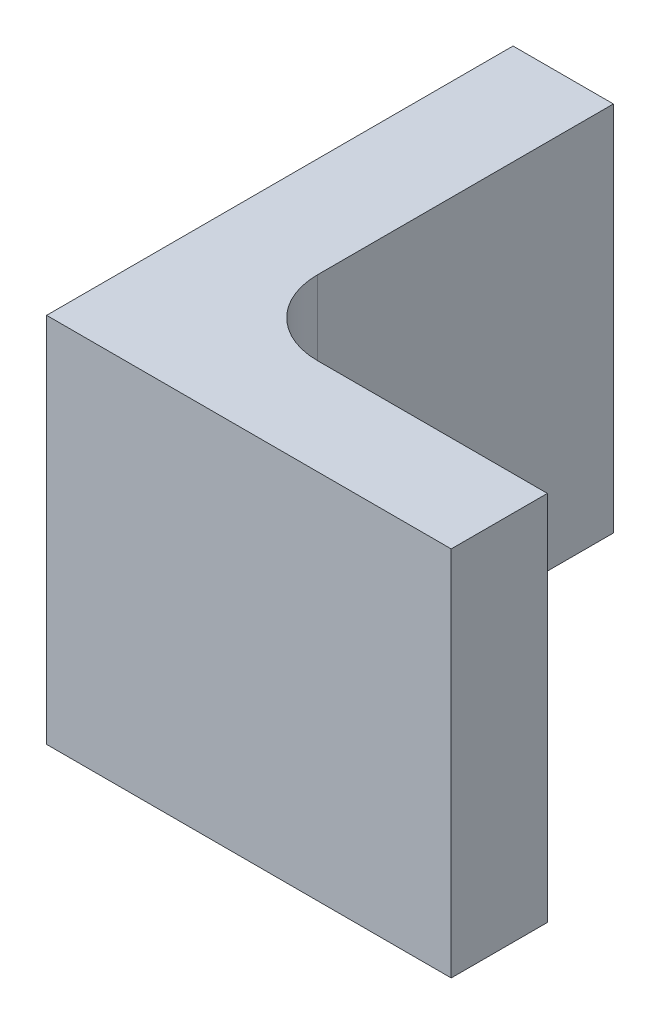
ISO-10303-21;
HEADER;
FILE_DESCRIPTION(('STEP AP214'),'2;1');
FILE_NAME('part.step','',(''),(''),'','','');
FILE_SCHEMA(('AUTOMOTIVE_DESIGN { 1 0 10303 214 1 1 1 1 }'));
ENDSEC;
DATA;
#1=APPLICATION_CONTEXT('core data for automotive mechanical design processes');
#2=APPLICATION_PROTOCOL_DEFINITION('international standard','automotive_design',2000,#1);
#3=PRODUCT_CONTEXT('',#1,'mechanical');
#4=PRODUCT('Part','Part','',(#3));
#5=PRODUCT_RELATED_PRODUCT_CATEGORY('part','',(#4));
#6=PRODUCT_DEFINITION_FORMATION('','',#4);
#7=PRODUCT_DEFINITION_CONTEXT('part definition',#1,'design');
#8=PRODUCT_DEFINITION('design','',#6,#7);
#9=PRODUCT_DEFINITION_SHAPE('','',#8);
#10=(LENGTH_UNIT() NAMED_UNIT(*) SI_UNIT(.MILLI.,.METRE.));
#11=(NAMED_UNIT(*) PLANE_ANGLE_UNIT() SI_UNIT($,.RADIAN.));
#12=(NAMED_UNIT(*) SI_UNIT($,.STERADIAN.) SOLID_ANGLE_UNIT());
#13=UNCERTAINTY_MEASURE_WITH_UNIT(LENGTH_MEASURE(1.E-05),#10,'distance_accuracy_value','');
#14=(GEOMETRIC_REPRESENTATION_CONTEXT(3) GLOBAL_UNCERTAINTY_ASSIGNED_CONTEXT((#13)) GLOBAL_UNIT_ASSIGNED_CONTEXT((#10,
#11,#12)) REPRESENTATION_CONTEXT('',''));
#15=CARTESIAN_POINT('',(0.,0.,0.));
#16=DIRECTION('',(0.,0.,1.));
#17=DIRECTION('',(1.,0.,0.));
#18=AXIS2_PLACEMENT_3D('',#15,#16,#17);
#19=CARTESIAN_POINT('',(0.,50.,-62.7616279069768));
#20=DIRECTION('',(1.,0.,0.));
#21=DIRECTION('',(0.,0.,-1.));
#22=AXIS2_PLACEMENT_3D('',#19,#20,#21);
#23=PLANE('',#22);
#24=DIRECTION('',(0.,0.,1.));
#25=VECTOR('',#24,1.);
#26=CARTESIAN_POINT('',(0.,0.,-62.7616279069768));
#27=LINE('',#26,#25);
#28=CARTESIAN_POINT('',(0.,0.,-62.7616279069768));
#29=VERTEX_POINT('',#28);
#30=CARTESIAN_POINT('',(0.,0.,0.));
#31=VERTEX_POINT('',#30);
#32=EDGE_CURVE('E123',#29,#31,#27,.T.);
#33=ORIENTED_EDGE('',*,*,#32,.T.);
#34=DIRECTION('',(0.,-1.,0.));
#35=VECTOR('',#34,1.);
#36=CARTESIAN_POINT('',(0.,50.,0.));
#37=LINE('',#36,#35);
#38=CARTESIAN_POINT('',(0.,50.,0.));
#39=VERTEX_POINT('',#38);
#40=EDGE_CURVE('E105',#39,#31,#37,.T.);
#41=ORIENTED_EDGE('',*,*,#40,.F.);
#42=DIRECTION('',(0.,0.,1.));
#43=VECTOR('',#42,1.);
#44=CARTESIAN_POINT('',(0.,50.,-62.7616279069768));
#45=LINE('',#44,#43);
#46=CARTESIAN_POINT('',(0.,50.,-62.7616279069768));
#47=VERTEX_POINT('',#46);
#48=EDGE_CURVE('E109',#47,#39,#45,.T.);
#49=ORIENTED_EDGE('',*,*,#48,.F.);
#50=DIRECTION('',(0.,-1.,0.));
#51=VECTOR('',#50,1.);
#52=CARTESIAN_POINT('',(0.,50.,-62.7616279069768));
#53=LINE('',#52,#51);
#54=EDGE_CURVE('E134',#47,#29,#53,.T.);
#55=ORIENTED_EDGE('',*,*,#54,.T.);
#56=EDGE_LOOP('',(#33,#41,#49,#55));
#57=FACE_BOUND('',#56,.T.);
#58=ADVANCED_FACE('F39',(#57),#23,.F.);
#59=CARTESIAN_POINT('',(0.,50.,0.));
#60=DIRECTION('',(0.,0.,-1.));
#61=DIRECTION('',(-1.,0.,0.));
#62=AXIS2_PLACEMENT_3D('',#59,#60,#61);
#63=PLANE('',#62);
#64=DIRECTION('',(1.,0.,0.));
#65=VECTOR('',#64,1.);
#66=CARTESIAN_POINT('',(0.,0.,0.));
#67=LINE('',#66,#65);
#68=CARTESIAN_POINT('',(54.4408530423065,0.,0.));
#69=VERTEX_POINT('',#68);
#70=EDGE_CURVE('E143',#31,#69,#67,.T.);
#71=ORIENTED_EDGE('',*,*,#70,.T.);
#72=DIRECTION('',(0.,-1.,0.));
#73=VECTOR('',#72,1.);
#74=CARTESIAN_POINT('',(54.4408530423065,50.,0.));
#75=LINE('',#74,#73);
#76=CARTESIAN_POINT('',(54.4408530423065,50.,0.));
#77=VERTEX_POINT('',#76);
#78=EDGE_CURVE('E103',#77,#69,#75,.T.);
#79=ORIENTED_EDGE('',*,*,#78,.F.);
#80=DIRECTION('',(1.,0.,0.));
#81=VECTOR('',#80,1.);
#82=CARTESIAN_POINT('',(0.,50.,0.));
#83=LINE('',#82,#81);
#84=EDGE_CURVE('E97',#39,#77,#83,.T.);
#85=ORIENTED_EDGE('',*,*,#84,.F.);
#86=ORIENTED_EDGE('',*,*,#40,.T.);
#87=EDGE_LOOP('',(#71,#79,#85,#86));
#88=FACE_BOUND('',#87,.T.);
#89=ADVANCED_FACE('F99',(#88),#63,.F.);
#90=CARTESIAN_POINT('',(54.4408530423065,50.,0.));
#91=DIRECTION('',(-1.,0.,0.));
#92=DIRECTION('',(0.,0.,1.));
#93=AXIS2_PLACEMENT_3D('',#90,#91,#92);
#94=PLANE('',#93);
#95=DIRECTION('',(0.,0.,-1.));
#96=VECTOR('',#95,1.);
#97=CARTESIAN_POINT('',(54.4408530423065,0.,0.));
#98=LINE('',#97,#96);
#99=CARTESIAN_POINT('',(54.4408530423065,0.,-12.9385509838998));
#100=VERTEX_POINT('',#99);
#101=EDGE_CURVE('E145',#69,#100,#98,.T.);
#102=ORIENTED_EDGE('',*,*,#101,.T.);
#103=DIRECTION('',(0.,-1.,0.));
#104=VECTOR('',#103,1.);
#105=CARTESIAN_POINT('',(54.4408530423065,50.,-12.9385509838998));
#106=LINE('',#105,#104);
#107=CARTESIAN_POINT('',(54.4408530423065,50.,-12.9385509838998));
#108=VERTEX_POINT('',#107);
#109=EDGE_CURVE('E128',#108,#100,#106,.T.);
#110=ORIENTED_EDGE('',*,*,#109,.F.);
#111=DIRECTION('',(0.,0.,-1.));
#112=VECTOR('',#111,1.);
#113=CARTESIAN_POINT('',(54.4408530423065,50.,0.));
#114=LINE('',#113,#112);
#115=EDGE_CURVE('E108',#77,#108,#114,.T.);
#116=ORIENTED_EDGE('',*,*,#115,.F.);
#117=ORIENTED_EDGE('',*,*,#78,.T.);
#118=EDGE_LOOP('',(#102,#110,#116,#117));
#119=FACE_BOUND('',#118,.T.);
#120=ADVANCED_FACE('F151',(#119),#94,.F.);
#121=CARTESIAN_POINT('',(54.4408530423065,50.,-12.9385509838998));
#122=DIRECTION('',(0.,0.,1.));
#123=DIRECTION('',(1.,0.,0.));
#124=AXIS2_PLACEMENT_3D('',#121,#122,#123);
#125=PLANE('',#124);
#126=DIRECTION('',(-1.,0.,0.));
#127=VECTOR('',#126,1.);
#128=CARTESIAN_POINT('',(54.4408530423065,0.,-12.9385509838998));
#129=LINE('',#128,#127);
#130=CARTESIAN_POINT('',(23.5009603768325,0.,-12.9385509838998));
#131=VERTEX_POINT('',#130);
#132=EDGE_CURVE('E139',#100,#131,#129,.T.);
#133=ORIENTED_EDGE('',*,*,#132,.T.);
#134=DIRECTION('',(0.,-1.,0.));
#135=VECTOR('',#134,1.);
#136=CARTESIAN_POINT('',(23.5009603768325,50.,-12.9385509838998));
#137=LINE('',#136,#135);
#138=CARTESIAN_POINT('',(23.5009603768325,50.,-12.9385509838998));
#139=VERTEX_POINT('',#138);
#140=EDGE_CURVE('E53',#131,#139,#137,.F.);
#141=ORIENTED_EDGE('',*,*,#140,.T.);
#142=DIRECTION('',(-1.,0.,0.));
#143=VECTOR('',#142,1.);
#144=CARTESIAN_POINT('',(54.4408530423065,50.,-12.9385509838998));
#145=LINE('',#144,#143);
#146=EDGE_CURVE('E148',#108,#139,#145,.T.);
#147=ORIENTED_EDGE('',*,*,#146,.F.);
#148=ORIENTED_EDGE('',*,*,#109,.T.);
#149=EDGE_LOOP('',(#133,#141,#147,#148));
#150=FACE_BOUND('',#149,.T.);
#151=ADVANCED_FACE('F160',(#150),#125,.F.);
#152=CARTESIAN_POINT('',(13.5009603768325,50.,-12.9385509838998));
#153=DIRECTION('',(-1.,0.,0.));
#154=DIRECTION('',(0.,0.,1.));
#155=AXIS2_PLACEMENT_3D('',#152,#153,#154);
#156=PLANE('',#155);
#157=DIRECTION('',(0.,0.,-1.));
#158=VECTOR('',#157,1.);
#159=CARTESIAN_POINT('',(13.5009603768325,50.,-12.9385509838998));
#160=LINE('',#159,#158);
#161=CARTESIAN_POINT('',(13.5009603768325,50.,-22.9385509838998));
#162=VERTEX_POINT('',#161);
#163=CARTESIAN_POINT('',(13.5009603768325,50.,-62.7616279069768));
#164=VERTEX_POINT('',#163);
#165=EDGE_CURVE('E149',#162,#164,#160,.T.);
#166=ORIENTED_EDGE('',*,*,#165,.F.);
#167=DIRECTION('',(0.,-1.,0.));
#168=VECTOR('',#167,1.);
#169=CARTESIAN_POINT('',(13.5009603768325,0.,-22.9385509838998));
#170=LINE('',#169,#168);
#171=CARTESIAN_POINT('',(13.5009603768325,0.,-22.9385509838998));
#172=VERTEX_POINT('',#171);
#173=EDGE_CURVE('E122',#162,#172,#170,.T.);
#174=ORIENTED_EDGE('',*,*,#173,.T.);
#175=DIRECTION('',(0.,0.,-1.));
#176=VECTOR('',#175,1.);
#177=CARTESIAN_POINT('',(13.5009603768325,0.,-12.9385509838998));
#178=LINE('',#177,#176);
#179=CARTESIAN_POINT('',(13.5009603768325,0.,-62.7616279069768));
#180=VERTEX_POINT('',#179);
#181=EDGE_CURVE('E138',#172,#180,#178,.T.);
#182=ORIENTED_EDGE('',*,*,#181,.T.);
#183=DIRECTION('',(0.,-1.,0.));
#184=VECTOR('',#183,1.);
#185=CARTESIAN_POINT('',(13.5009603768325,50.,-62.7616279069768));
#186=LINE('',#185,#184);
#187=EDGE_CURVE('E135',#164,#180,#186,.T.);
#188=ORIENTED_EDGE('',*,*,#187,.F.);
#189=EDGE_LOOP('',(#166,#174,#182,#188));
#190=FACE_BOUND('',#189,.T.);
#191=ADVANCED_FACE('F159',(#190),#156,.F.);
#192=CARTESIAN_POINT('',(13.5009603768325,50.,-62.7616279069768));
#193=DIRECTION('',(0.,0.,1.));
#194=DIRECTION('',(1.,0.,0.));
#195=AXIS2_PLACEMENT_3D('',#192,#193,#194);
#196=PLANE('',#195);
#197=DIRECTION('',(-1.,0.,0.));
#198=VECTOR('',#197,1.);
#199=CARTESIAN_POINT('',(13.5009603768325,0.,-62.7616279069768));
#200=LINE('',#199,#198);
#201=EDGE_CURVE('E118',#180,#29,#200,.T.);
#202=ORIENTED_EDGE('',*,*,#201,.T.);
#203=ORIENTED_EDGE('',*,*,#54,.F.);
#204=DIRECTION('',(-1.,0.,0.));
#205=VECTOR('',#204,1.);
#206=CARTESIAN_POINT('',(13.5009603768325,50.,-62.7616279069768));
#207=LINE('',#206,#205);
#208=EDGE_CURVE('E114',#164,#47,#207,.T.);
#209=ORIENTED_EDGE('',*,*,#208,.F.);
#210=ORIENTED_EDGE('',*,*,#187,.T.);
#211=EDGE_LOOP('',(#202,#203,#209,#210));
#212=FACE_BOUND('',#211,.T.);
#213=ADVANCED_FACE('F161',(#212),#196,.F.);
#214=CARTESIAN_POINT('',(0.,50.,0.));
#215=DIRECTION('',(0.,1.,0.));
#216=DIRECTION('',(0.,0.,1.));
#217=AXIS2_PLACEMENT_3D('',#214,#215,#216);
#218=PLANE('',#217);
#219=ORIENTED_EDGE('',*,*,#48,.T.);
#220=ORIENTED_EDGE('',*,*,#84,.T.);
#221=ORIENTED_EDGE('',*,*,#115,.T.);
#222=ORIENTED_EDGE('',*,*,#146,.T.);
#223=CARTESIAN_POINT('',(23.5009603768325,50.,-22.9385509838998));
#224=DIRECTION('',(0.,1.,0.));
#225=DIRECTION('',(0.,0.,1.));
#226=AXIS2_PLACEMENT_3D('',#223,#224,#225);
#227=CIRCLE('',#226,10.);
#228=EDGE_CURVE('E11',#139,#162,#227,.F.);
#229=ORIENTED_EDGE('',*,*,#228,.T.);
#230=ORIENTED_EDGE('',*,*,#165,.T.);
#231=ORIENTED_EDGE('',*,*,#208,.T.);
#232=EDGE_LOOP('',(#219,#220,#221,#222,#229,#230,#231));
#233=FACE_BOUND('',#232,.T.);
#234=ADVANCED_FACE('F115',(#233),#218,.T.);
#235=CARTESIAN_POINT('',(0.,0.,0.));
#236=DIRECTION('',(0.,1.,0.));
#237=DIRECTION('',(0.,0.,1.));
#238=AXIS2_PLACEMENT_3D('',#235,#236,#237);
#239=PLANE('',#238);
#240=ORIENTED_EDGE('',*,*,#32,.F.);
#241=ORIENTED_EDGE('',*,*,#201,.F.);
#242=ORIENTED_EDGE('',*,*,#181,.F.);
#243=CARTESIAN_POINT('',(23.5009603768325,0.,-22.9385509838998));
#244=DIRECTION('',(0.,1.,0.));
#245=DIRECTION('',(0.,0.,1.));
#246=AXIS2_PLACEMENT_3D('',#243,#244,#245);
#247=CIRCLE('',#246,10.);
#248=EDGE_CURVE('E50',#172,#131,#247,.T.);
#249=ORIENTED_EDGE('',*,*,#248,.T.);
#250=ORIENTED_EDGE('',*,*,#132,.F.);
#251=ORIENTED_EDGE('',*,*,#101,.F.);
#252=ORIENTED_EDGE('',*,*,#70,.F.);
#253=EDGE_LOOP('',(#240,#241,#242,#249,#250,#251,#252));
#254=FACE_BOUND('',#253,.T.);
#255=ADVANCED_FACE('F201',(#254),#239,.F.);
#256=CARTESIAN_POINT('',(23.5009603768325,50.,-22.9385509838998));
#257=DIRECTION('',(0.,1.,0.));
#258=DIRECTION('',(0.,0.,1.));
#259=AXIS2_PLACEMENT_3D('',#256,#257,#258);
#260=CYLINDRICAL_SURFACE('',#259,10.);
#261=ORIENTED_EDGE('',*,*,#228,.F.);
#262=ORIENTED_EDGE('',*,*,#140,.F.);
#263=ORIENTED_EDGE('',*,*,#248,.F.);
#264=ORIENTED_EDGE('',*,*,#173,.F.);
#265=EDGE_LOOP('',(#261,#262,#263,#264));
#266=FACE_BOUND('',#265,.T.);
#267=ADVANCED_FACE('F41',(#266),#260,.F.);
#268=CLOSED_SHELL('',(#58,#89,#120,#151,#191,#213,#234,#255,#267));
#269=MANIFOLD_SOLID_BREP('B2',#268);
#270=ADVANCED_BREP_SHAPE_REPRESENTATION('',(#18,#269),#14);
#271=SHAPE_DEFINITION_REPRESENTATION(#9,#270);
ENDSEC;
END-ISO-10303-21;
